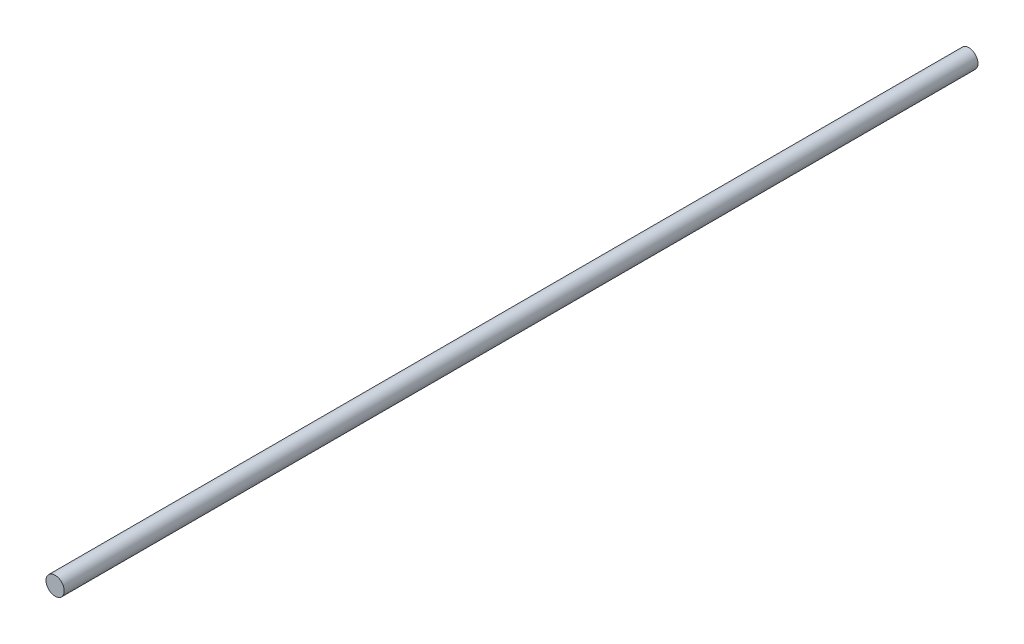
ISO-10303-21;
HEADER;
FILE_DESCRIPTION(('STEP AP214'),'2;1');
FILE_NAME('part.step','',(''),(''),'','','');
FILE_SCHEMA(('AUTOMOTIVE_DESIGN { 1 0 10303 214 1 1 1 1 }'));
ENDSEC;
DATA;
#1=APPLICATION_CONTEXT('core data for automotive mechanical design processes');
#2=APPLICATION_PROTOCOL_DEFINITION('international standard','automotive_design',2000,#1);
#3=PRODUCT_CONTEXT('',#1,'mechanical');
#4=PRODUCT('Part','Part','',(#3));
#5=PRODUCT_RELATED_PRODUCT_CATEGORY('part','',(#4));
#6=PRODUCT_DEFINITION_FORMATION('','',#4);
#7=PRODUCT_DEFINITION_CONTEXT('part definition',#1,'design');
#8=PRODUCT_DEFINITION('design','',#6,#7);
#9=PRODUCT_DEFINITION_SHAPE('','',#8);
#10=(LENGTH_UNIT() NAMED_UNIT(*) SI_UNIT(.MILLI.,.METRE.));
#11=(NAMED_UNIT(*) PLANE_ANGLE_UNIT() SI_UNIT($,.RADIAN.));
#12=(NAMED_UNIT(*) SI_UNIT($,.STERADIAN.) SOLID_ANGLE_UNIT());
#13=UNCERTAINTY_MEASURE_WITH_UNIT(LENGTH_MEASURE(1.E-05),#10,'distance_accuracy_value','');
#14=(GEOMETRIC_REPRESENTATION_CONTEXT(3) GLOBAL_UNCERTAINTY_ASSIGNED_CONTEXT((#13)) GLOBAL_UNIT_ASSIGNED_CONTEXT((#10,
#11,#12)) REPRESENTATION_CONTEXT('',''));
#15=CARTESIAN_POINT('',(0.,0.,0.));
#16=DIRECTION('',(0.,0.,1.));
#17=DIRECTION('',(1.,0.,0.));
#18=AXIS2_PLACEMENT_3D('',#15,#16,#17);
#19=CARTESIAN_POINT('',(0.,0.,0.));
#20=DIRECTION('',(0.,0.,1.));
#21=DIRECTION('',(1.,0.,0.));
#22=AXIS2_PLACEMENT_3D('',#19,#20,#21);
#23=CYLINDRICAL_SURFACE('',#22,3.4);
#24=CARTESIAN_POINT('',(0.,0.,0.));
#25=DIRECTION('',(0.,0.,1.));
#26=DIRECTION('',(1.,0.,0.));
#27=AXIS2_PLACEMENT_3D('',#24,#25,#26);
#28=CIRCLE('',#27,3.4);
#29=CARTESIAN_POINT('',(3.4,0.,0.));
#30=VERTEX_POINT('',#29);
#31=EDGE_CURVE('E10',#30,#30,#28,.T.);
#32=ORIENTED_EDGE('',*,*,#31,.T.);
#33=EDGE_LOOP('',(#32));
#34=FACE_BOUND('',#33,.T.);
#35=CARTESIAN_POINT('',(0.,0.,340.));
#36=DIRECTION('',(0.,0.,1.));
#37=DIRECTION('',(1.,0.,0.));
#38=AXIS2_PLACEMENT_3D('',#35,#36,#37);
#39=CIRCLE('',#38,3.4);
#40=CARTESIAN_POINT('',(3.4,0.,340.));
#41=VERTEX_POINT('',#40);
#42=EDGE_CURVE('E39',#41,#41,#39,.T.);
#43=ORIENTED_EDGE('',*,*,#42,.F.);
#44=EDGE_LOOP('',(#43));
#45=FACE_BOUND('',#44,.T.);
#46=ADVANCED_FACE('F33',(#34,#45),#23,.T.);
#47=CARTESIAN_POINT('',(3.4,0.,0.));
#48=DIRECTION('',(0.,0.,-1.));
#49=DIRECTION('',(-1.,0.,0.));
#50=AXIS2_PLACEMENT_3D('',#47,#48,#49);
#51=PLANE('',#50);
#52=ORIENTED_EDGE('',*,*,#31,.F.);
#53=EDGE_LOOP('',(#52));
#54=FACE_BOUND('',#53,.T.);
#55=ADVANCED_FACE('F48',(#54),#51,.T.);
#56=CARTESIAN_POINT('',(0.,0.,340.));
#57=DIRECTION('',(0.,0.,1.));
#58=DIRECTION('',(1.,0.,0.));
#59=AXIS2_PLACEMENT_3D('',#56,#57,#58);
#60=PLANE('',#59);
#61=ORIENTED_EDGE('',*,*,#42,.T.);
#62=EDGE_LOOP('',(#61));
#63=FACE_BOUND('',#62,.T.);
#64=ADVANCED_FACE('F45',(#63),#60,.T.);
#65=CLOSED_SHELL('',(#46,#55,#64));
#66=MANIFOLD_SOLID_BREP('B2',#65);
#67=ADVANCED_BREP_SHAPE_REPRESENTATION('',(#18,#66),#14);
#68=SHAPE_DEFINITION_REPRESENTATION(#9,#67);
ENDSEC;
END-ISO-10303-21;
